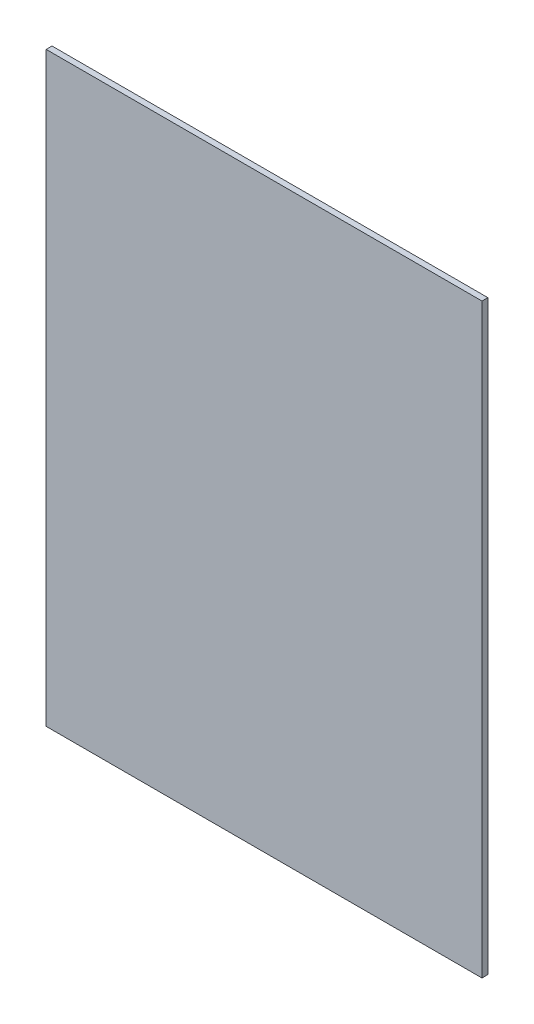
ISO-10303-21;
HEADER;
FILE_DESCRIPTION(('STEP AP214'),'2;1');
FILE_NAME('part.step','',(''),(''),'','','');
FILE_SCHEMA(('AUTOMOTIVE_DESIGN { 1 0 10303 214 1 1 1 1 }'));
ENDSEC;
DATA;
#1=APPLICATION_CONTEXT('core data for automotive mechanical design processes');
#2=APPLICATION_PROTOCOL_DEFINITION('international standard','automotive_design',2000,#1);
#3=PRODUCT_CONTEXT('',#1,'mechanical');
#4=PRODUCT('Part','Part','',(#3));
#5=PRODUCT_RELATED_PRODUCT_CATEGORY('part','',(#4));
#6=PRODUCT_DEFINITION_FORMATION('','',#4);
#7=PRODUCT_DEFINITION_CONTEXT('part definition',#1,'design');
#8=PRODUCT_DEFINITION('design','',#6,#7);
#9=PRODUCT_DEFINITION_SHAPE('','',#8);
#10=(LENGTH_UNIT() NAMED_UNIT(*) SI_UNIT(.MILLI.,.METRE.));
#11=(NAMED_UNIT(*) PLANE_ANGLE_UNIT() SI_UNIT($,.RADIAN.));
#12=(NAMED_UNIT(*) SI_UNIT($,.STERADIAN.) SOLID_ANGLE_UNIT());
#13=UNCERTAINTY_MEASURE_WITH_UNIT(LENGTH_MEASURE(1.E-05),#10,'distance_accuracy_value','');
#14=(GEOMETRIC_REPRESENTATION_CONTEXT(3) GLOBAL_UNCERTAINTY_ASSIGNED_CONTEXT((#13)) GLOBAL_UNIT_ASSIGNED_CONTEXT((#10,
#11,#12)) REPRESENTATION_CONTEXT('',''));
#15=CARTESIAN_POINT('',(0.,0.,0.));
#16=DIRECTION('',(0.,0.,1.));
#17=DIRECTION('',(1.,0.,0.));
#18=AXIS2_PLACEMENT_3D('',#15,#16,#17);
#19=CARTESIAN_POINT('',(111.5,150.,3.));
#20=DIRECTION('',(-1.,0.,0.));
#21=DIRECTION('',(0.,-1.,0.));
#22=AXIS2_PLACEMENT_3D('',#19,#20,#21);
#23=PLANE('',#22);
#24=DIRECTION('',(0.,1.,0.));
#25=VECTOR('',#24,1.);
#26=CARTESIAN_POINT('',(111.5,150.,0.));
#27=LINE('',#26,#25);
#28=CARTESIAN_POINT('',(111.5,-150.,0.));
#29=VERTEX_POINT('',#28);
#30=CARTESIAN_POINT('',(111.5,150.,0.));
#31=VERTEX_POINT('',#30);
#32=EDGE_CURVE('E102',#29,#31,#27,.T.);
#33=ORIENTED_EDGE('',*,*,#32,.T.);
#34=DIRECTION('',(0.,0.,-1.));
#35=VECTOR('',#34,1.);
#36=CARTESIAN_POINT('',(111.5,150.,3.));
#37=LINE('',#36,#35);
#38=CARTESIAN_POINT('',(111.5,150.,3.));
#39=VERTEX_POINT('',#38);
#40=EDGE_CURVE('E11',#39,#31,#37,.T.);
#41=ORIENTED_EDGE('',*,*,#40,.F.);
#42=DIRECTION('',(0.,1.,0.));
#43=VECTOR('',#42,1.);
#44=CARTESIAN_POINT('',(111.5,150.,3.));
#45=LINE('',#44,#43);
#46=CARTESIAN_POINT('',(111.5,-150.,3.));
#47=VERTEX_POINT('',#46);
#48=EDGE_CURVE('E90',#47,#39,#45,.T.);
#49=ORIENTED_EDGE('',*,*,#48,.F.);
#50=DIRECTION('',(0.,0.,-1.));
#51=VECTOR('',#50,1.);
#52=CARTESIAN_POINT('',(111.5,-150.,3.));
#53=LINE('',#52,#51);
#54=EDGE_CURVE('E98',#47,#29,#53,.T.);
#55=ORIENTED_EDGE('',*,*,#54,.T.);
#56=EDGE_LOOP('',(#33,#41,#49,#55));
#57=FACE_BOUND('',#56,.T.);
#58=ADVANCED_FACE('F39',(#57),#23,.F.);
#59=CARTESIAN_POINT('',(-111.5,150.,3.));
#60=DIRECTION('',(0.,-1.,0.));
#61=DIRECTION('',(0.,0.,-1.));
#62=AXIS2_PLACEMENT_3D('',#59,#60,#61);
#63=PLANE('',#62);
#64=DIRECTION('',(-1.,0.,0.));
#65=VECTOR('',#64,1.);
#66=CARTESIAN_POINT('',(-111.5,150.,0.));
#67=LINE('',#66,#65);
#68=CARTESIAN_POINT('',(-111.5,150.,0.));
#69=VERTEX_POINT('',#68);
#70=EDGE_CURVE('E94',#31,#69,#67,.T.);
#71=ORIENTED_EDGE('',*,*,#70,.T.);
#72=DIRECTION('',(0.,0.,-1.));
#73=VECTOR('',#72,1.);
#74=CARTESIAN_POINT('',(-111.5,150.,3.));
#75=LINE('',#74,#73);
#76=CARTESIAN_POINT('',(-111.5,150.,3.));
#77=VERTEX_POINT('',#76);
#78=EDGE_CURVE('E47',#77,#69,#75,.T.);
#79=ORIENTED_EDGE('',*,*,#78,.F.);
#80=DIRECTION('',(-1.,0.,0.));
#81=VECTOR('',#80,1.);
#82=CARTESIAN_POINT('',(-111.5,150.,3.));
#83=LINE('',#82,#81);
#84=EDGE_CURVE('E85',#39,#77,#83,.T.);
#85=ORIENTED_EDGE('',*,*,#84,.F.);
#86=ORIENTED_EDGE('',*,*,#40,.T.);
#87=EDGE_LOOP('',(#71,#79,#85,#86));
#88=FACE_BOUND('',#87,.T.);
#89=ADVANCED_FACE('F93',(#88),#63,.F.);
#90=CARTESIAN_POINT('',(-111.5,150.,3.));
#91=DIRECTION('',(1.,0.,0.));
#92=DIRECTION('',(0.,1.,0.));
#93=AXIS2_PLACEMENT_3D('',#90,#91,#92);
#94=PLANE('',#93);
#95=DIRECTION('',(0.,-1.,0.));
#96=VECTOR('',#95,1.);
#97=CARTESIAN_POINT('',(-111.5,150.,0.));
#98=LINE('',#97,#96);
#99=CARTESIAN_POINT('',(-111.5,-150.,0.));
#100=VERTEX_POINT('',#99);
#101=EDGE_CURVE('E72',#69,#100,#98,.T.);
#102=ORIENTED_EDGE('',*,*,#101,.T.);
#103=DIRECTION('',(0.,0.,-1.));
#104=VECTOR('',#103,1.);
#105=CARTESIAN_POINT('',(-111.5,-150.,3.));
#106=LINE('',#105,#104);
#107=CARTESIAN_POINT('',(-111.5,-150.,3.));
#108=VERTEX_POINT('',#107);
#109=EDGE_CURVE('E95',#108,#100,#106,.T.);
#110=ORIENTED_EDGE('',*,*,#109,.F.);
#111=DIRECTION('',(0.,-1.,0.));
#112=VECTOR('',#111,1.);
#113=CARTESIAN_POINT('',(-111.5,150.,3.));
#114=LINE('',#113,#112);
#115=EDGE_CURVE('E88',#77,#108,#114,.T.);
#116=ORIENTED_EDGE('',*,*,#115,.F.);
#117=ORIENTED_EDGE('',*,*,#78,.T.);
#118=EDGE_LOOP('',(#102,#110,#116,#117));
#119=FACE_BOUND('',#118,.T.);
#120=ADVANCED_FACE('F96',(#119),#94,.F.);
#121=CARTESIAN_POINT('',(-111.5,-150.,3.));
#122=DIRECTION('',(0.,1.,0.));
#123=DIRECTION('',(0.,0.,1.));
#124=AXIS2_PLACEMENT_3D('',#121,#122,#123);
#125=PLANE('',#124);
#126=DIRECTION('',(1.,0.,0.));
#127=VECTOR('',#126,1.);
#128=CARTESIAN_POINT('',(-111.5,-150.,0.));
#129=LINE('',#128,#127);
#130=EDGE_CURVE('E78',#100,#29,#129,.T.);
#131=ORIENTED_EDGE('',*,*,#130,.T.);
#132=ORIENTED_EDGE('',*,*,#54,.F.);
#133=DIRECTION('',(1.,0.,0.));
#134=VECTOR('',#133,1.);
#135=CARTESIAN_POINT('',(-111.5,-150.,3.));
#136=LINE('',#135,#134);
#137=EDGE_CURVE('E55',#108,#47,#136,.T.);
#138=ORIENTED_EDGE('',*,*,#137,.F.);
#139=ORIENTED_EDGE('',*,*,#109,.T.);
#140=EDGE_LOOP('',(#131,#132,#138,#139));
#141=FACE_BOUND('',#140,.T.);
#142=ADVANCED_FACE('F109',(#141),#125,.F.);
#143=CARTESIAN_POINT('',(0.,0.,3.));
#144=DIRECTION('',(0.,0.,1.));
#145=DIRECTION('',(1.,0.,0.));
#146=AXIS2_PLACEMENT_3D('',#143,#144,#145);
#147=PLANE('',#146);
#148=ORIENTED_EDGE('',*,*,#48,.T.);
#149=ORIENTED_EDGE('',*,*,#84,.T.);
#150=ORIENTED_EDGE('',*,*,#115,.T.);
#151=ORIENTED_EDGE('',*,*,#137,.T.);
#152=EDGE_LOOP('',(#148,#149,#150,#151));
#153=FACE_BOUND('',#152,.T.);
#154=ADVANCED_FACE('F86',(#153),#147,.T.);
#155=CARTESIAN_POINT('',(0.,0.,0.));
#156=DIRECTION('',(0.,0.,1.));
#157=DIRECTION('',(1.,0.,0.));
#158=AXIS2_PLACEMENT_3D('',#155,#156,#157);
#159=PLANE('',#158);
#160=ORIENTED_EDGE('',*,*,#32,.F.);
#161=ORIENTED_EDGE('',*,*,#130,.F.);
#162=ORIENTED_EDGE('',*,*,#101,.F.);
#163=ORIENTED_EDGE('',*,*,#70,.F.);
#164=EDGE_LOOP('',(#160,#161,#162,#163));
#165=FACE_BOUND('',#164,.T.);
#166=ADVANCED_FACE('F112',(#165),#159,.F.);
#167=CLOSED_SHELL('',(#58,#89,#120,#142,#154,#166));
#168=MANIFOLD_SOLID_BREP('B2',#167);
#169=ADVANCED_BREP_SHAPE_REPRESENTATION('',(#18,#168),#14);
#170=SHAPE_DEFINITION_REPRESENTATION(#9,#169);
ENDSEC;
END-ISO-10303-21;
